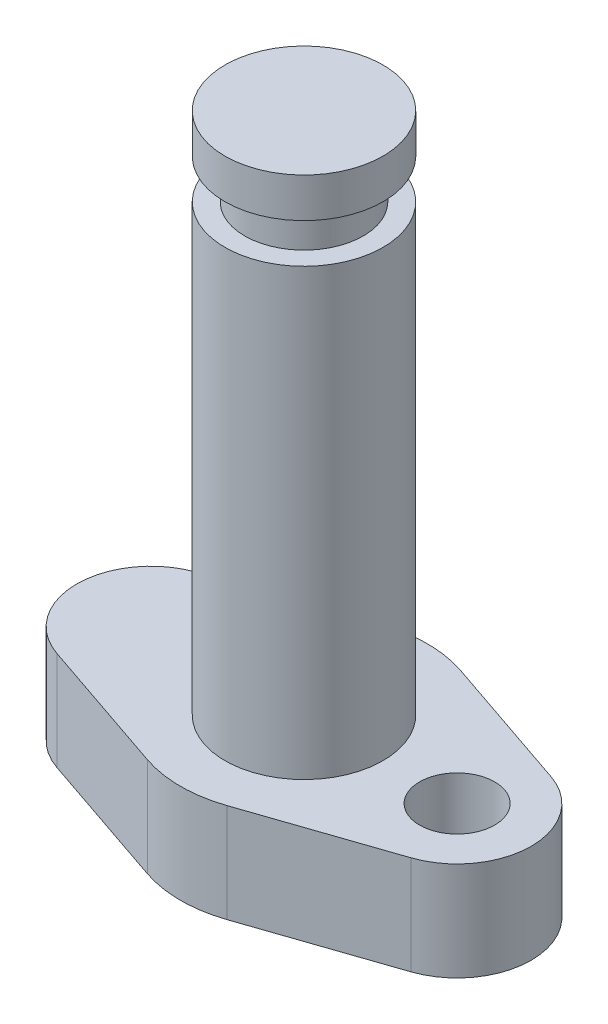
ISO-10303-21;
HEADER;
FILE_DESCRIPTION(('STEP AP214'),'2;1');
FILE_NAME('part.step','',(''),(''),'','','');
FILE_SCHEMA(('AUTOMOTIVE_DESIGN { 1 0 10303 214 1 1 1 1 }'));
ENDSEC;
DATA;
#1=APPLICATION_CONTEXT('core data for automotive mechanical design processes');
#2=APPLICATION_PROTOCOL_DEFINITION('international standard','automotive_design',2000,#1);
#3=PRODUCT_CONTEXT('',#1,'mechanical');
#4=PRODUCT('Part','Part','',(#3));
#5=PRODUCT_RELATED_PRODUCT_CATEGORY('part','',(#4));
#6=PRODUCT_DEFINITION_FORMATION('','',#4);
#7=PRODUCT_DEFINITION_CONTEXT('part definition',#1,'design');
#8=PRODUCT_DEFINITION('design','',#6,#7);
#9=PRODUCT_DEFINITION_SHAPE('','',#8);
#10=(LENGTH_UNIT() NAMED_UNIT(*) SI_UNIT(.MILLI.,.METRE.));
#11=(NAMED_UNIT(*) PLANE_ANGLE_UNIT() SI_UNIT($,.RADIAN.));
#12=(NAMED_UNIT(*) SI_UNIT($,.STERADIAN.) SOLID_ANGLE_UNIT());
#13=UNCERTAINTY_MEASURE_WITH_UNIT(LENGTH_MEASURE(1.E-05),#10,'distance_accuracy_value','');
#14=(GEOMETRIC_REPRESENTATION_CONTEXT(3) GLOBAL_UNCERTAINTY_ASSIGNED_CONTEXT((#13)) GLOBAL_UNIT_ASSIGNED_CONTEXT((#10,
#11,#12)) REPRESENTATION_CONTEXT('',''));
#15=CARTESIAN_POINT('',(0.,0.,0.));
#16=DIRECTION('',(0.,0.,1.));
#17=DIRECTION('',(1.,0.,0.));
#18=AXIS2_PLACEMENT_3D('',#15,#16,#17);
#19=CARTESIAN_POINT('',(-2.01612903225807,5.,-5.91588739964565));
#20=DIRECTION('',(-0.32258064516129,0.,-0.946541983943304));
#21=DIRECTION('',(-0.946541983943304,0.,0.32258064516129));
#22=AXIS2_PLACEMENT_3D('',#19,#20,#21);
#23=PLANE('',#22);
#24=DIRECTION('',(0.946541983943304,0.,-0.32258064516129));
#25=VECTOR('',#24,1.);
#26=CARTESIAN_POINT('',(-2.01612903225807,0.,-5.91588739964565));
#27=LINE('',#26,#25);
#28=CARTESIAN_POINT('',(-8.95967741935484,0.,-3.54953243978739));
#29=VERTEX_POINT('',#28);
#30=CARTESIAN_POINT('',(-2.01612903225806,0.,-5.91588739964565));
#31=VERTEX_POINT('',#30);
#32=EDGE_CURVE('E132',#29,#31,#27,.T.);
#33=ORIENTED_EDGE('',*,*,#32,.F.);
#34=DIRECTION('',(0.,-1.,0.));
#35=VECTOR('',#34,1.);
#36=CARTESIAN_POINT('',(-8.95967741935484,5.,-3.54953243978739));
#37=LINE('',#36,#35);
#38=CARTESIAN_POINT('',(-8.95967741935484,5.,-3.54953243978739));
#39=VERTEX_POINT('',#38);
#40=EDGE_CURVE('E38',#39,#29,#37,.T.);
#41=ORIENTED_EDGE('',*,*,#40,.F.);
#42=DIRECTION('',(0.946541983943304,0.,-0.32258064516129));
#43=VECTOR('',#42,1.);
#44=CARTESIAN_POINT('',(-2.01612903225807,5.,-5.91588739964565));
#45=LINE('',#44,#43);
#46=CARTESIAN_POINT('',(-2.01612903225806,5.,-5.91588739964565));
#47=VERTEX_POINT('',#46);
#48=EDGE_CURVE('E171',#39,#47,#45,.T.);
#49=ORIENTED_EDGE('',*,*,#48,.T.);
#50=DIRECTION('',(0.,-1.,0.));
#51=VECTOR('',#50,1.);
#52=CARTESIAN_POINT('',(-2.01612903225806,5.,-5.91588739964565));
#53=LINE('',#52,#51);
#54=EDGE_CURVE('E88',#47,#31,#53,.T.);
#55=ORIENTED_EDGE('',*,*,#54,.T.);
#56=EDGE_LOOP('',(#33,#41,#49,#55));
#57=FACE_BOUND('',#56,.T.);
#58=ADVANCED_FACE('F35',(#57),#23,.T.);
#59=CARTESIAN_POINT('',(-7.75,5.,0.));
#60=DIRECTION('',(0.,-1.,0.));
#61=DIRECTION('',(0.,0.,-1.));
#62=AXIS2_PLACEMENT_3D('',#59,#60,#61);
#63=CYLINDRICAL_SURFACE('',#62,3.75);
#64=CARTESIAN_POINT('',(-7.75,0.,0.));
#65=DIRECTION('',(0.,1.,0.));
#66=DIRECTION('',(0.,0.,1.));
#67=AXIS2_PLACEMENT_3D('',#64,#65,#66);
#68=CIRCLE('',#67,3.75);
#69=CARTESIAN_POINT('',(-8.95967741935484,0.,3.54953243978739));
#70=VERTEX_POINT('',#69);
#71=EDGE_CURVE('E135',#29,#70,#68,.T.);
#72=ORIENTED_EDGE('',*,*,#71,.T.);
#73=DIRECTION('',(0.,-1.,0.));
#74=VECTOR('',#73,1.);
#75=CARTESIAN_POINT('',(-8.95967741935484,5.,3.54953243978739));
#76=LINE('',#75,#74);
#77=CARTESIAN_POINT('',(-8.95967741935484,5.,3.54953243978739));
#78=VERTEX_POINT('',#77);
#79=EDGE_CURVE('E157',#78,#70,#76,.T.);
#80=ORIENTED_EDGE('',*,*,#79,.F.);
#81=CARTESIAN_POINT('',(-7.75,5.,0.));
#82=DIRECTION('',(0.,1.,0.));
#83=DIRECTION('',(0.,0.,1.));
#84=AXIS2_PLACEMENT_3D('',#81,#82,#83);
#85=CIRCLE('',#84,3.75);
#86=EDGE_CURVE('E173',#39,#78,#85,.T.);
#87=ORIENTED_EDGE('',*,*,#86,.F.);
#88=ORIENTED_EDGE('',*,*,#40,.T.);
#89=EDGE_LOOP('',(#72,#80,#87,#88));
#90=FACE_BOUND('',#89,.T.);
#91=ADVANCED_FACE('F185',(#90),#63,.T.);
#92=CARTESIAN_POINT('',(-2.01612903225806,5.,5.91588739964565));
#93=DIRECTION('',(0.32258064516129,0.,-0.946541983943304));
#94=DIRECTION('',(-0.946541983943304,0.,-0.32258064516129));
#95=AXIS2_PLACEMENT_3D('',#92,#93,#94);
#96=PLANE('',#95);
#97=DIRECTION('',(0.946541983943304,0.,0.32258064516129));
#98=VECTOR('',#97,1.);
#99=CARTESIAN_POINT('',(-2.01612903225806,0.,5.91588739964565));
#100=LINE('',#99,#98);
#101=CARTESIAN_POINT('',(-2.01612903225806,0.,5.91588739964565));
#102=VERTEX_POINT('',#101);
#103=EDGE_CURVE('E138',#70,#102,#100,.T.);
#104=ORIENTED_EDGE('',*,*,#103,.T.);
#105=DIRECTION('',(0.,-1.,0.));
#106=VECTOR('',#105,1.);
#107=CARTESIAN_POINT('',(-2.01612903225806,5.,5.91588739964565));
#108=LINE('',#107,#106);
#109=CARTESIAN_POINT('',(-2.01612903225806,5.,5.91588739964565));
#110=VERTEX_POINT('',#109);
#111=EDGE_CURVE('E155',#110,#102,#108,.T.);
#112=ORIENTED_EDGE('',*,*,#111,.F.);
#113=DIRECTION('',(0.946541983943304,0.,0.32258064516129));
#114=VECTOR('',#113,1.);
#115=CARTESIAN_POINT('',(-2.01612903225806,5.,5.91588739964565));
#116=LINE('',#115,#114);
#117=EDGE_CURVE('E175',#78,#110,#116,.T.);
#118=ORIENTED_EDGE('',*,*,#117,.F.);
#119=ORIENTED_EDGE('',*,*,#79,.T.);
#120=EDGE_LOOP('',(#104,#112,#118,#119));
#121=FACE_BOUND('',#120,.T.);
#122=ADVANCED_FACE('F186',(#121),#96,.F.);
#123=CARTESIAN_POINT('',(0.,5.,0.));
#124=DIRECTION('',(0.,-1.,0.));
#125=DIRECTION('',(0.,0.,-1.));
#126=AXIS2_PLACEMENT_3D('',#123,#124,#125);
#127=CYLINDRICAL_SURFACE('',#126,6.25);
#128=CARTESIAN_POINT('',(0.,0.,0.));
#129=DIRECTION('',(0.,1.,0.));
#130=DIRECTION('',(0.,0.,1.));
#131=AXIS2_PLACEMENT_3D('',#128,#129,#130);
#132=CIRCLE('',#131,6.25);
#133=CARTESIAN_POINT('',(2.01612903225806,0.,5.91588739964565));
#134=VERTEX_POINT('',#133);
#135=EDGE_CURVE('E140',#102,#134,#132,.T.);
#136=ORIENTED_EDGE('',*,*,#135,.T.);
#137=DIRECTION('',(0.,-1.,0.));
#138=VECTOR('',#137,1.);
#139=CARTESIAN_POINT('',(2.01612903225806,5.,5.91588739964565));
#140=LINE('',#139,#138);
#141=CARTESIAN_POINT('',(2.01612903225806,5.,5.91588739964565));
#142=VERTEX_POINT('',#141);
#143=EDGE_CURVE('E153',#142,#134,#140,.T.);
#144=ORIENTED_EDGE('',*,*,#143,.F.);
#145=CARTESIAN_POINT('',(0.,5.,0.));
#146=DIRECTION('',(0.,1.,0.));
#147=DIRECTION('',(0.,0.,1.));
#148=AXIS2_PLACEMENT_3D('',#145,#146,#147);
#149=CIRCLE('',#148,6.25);
#150=EDGE_CURVE('E129',#110,#142,#149,.T.);
#151=ORIENTED_EDGE('',*,*,#150,.F.);
#152=ORIENTED_EDGE('',*,*,#111,.T.);
#153=EDGE_LOOP('',(#136,#144,#151,#152));
#154=FACE_BOUND('',#153,.T.);
#155=ADVANCED_FACE('F189',(#154),#127,.T.);
#156=CARTESIAN_POINT('',(2.01612903225806,5.,5.91588739964565));
#157=DIRECTION('',(0.32258064516129,0.,0.946541983943304));
#158=DIRECTION('',(0.946541983943304,0.,-0.32258064516129));
#159=AXIS2_PLACEMENT_3D('',#156,#157,#158);
#160=PLANE('',#159);
#161=DIRECTION('',(-0.946541983943304,0.,0.32258064516129));
#162=VECTOR('',#161,1.);
#163=CARTESIAN_POINT('',(2.01612903225806,0.,5.91588739964565));
#164=LINE('',#163,#162);
#165=CARTESIAN_POINT('',(8.95967741935484,0.,3.54953243978739));
#166=VERTEX_POINT('',#165);
#167=EDGE_CURVE('E143',#166,#134,#164,.T.);
#168=ORIENTED_EDGE('',*,*,#167,.F.);
#169=DIRECTION('',(0.,-1.,0.));
#170=VECTOR('',#169,1.);
#171=CARTESIAN_POINT('',(8.95967741935484,5.,3.54953243978739));
#172=LINE('',#171,#170);
#173=CARTESIAN_POINT('',(8.95967741935484,5.,3.54953243978739));
#174=VERTEX_POINT('',#173);
#175=EDGE_CURVE('E124',#174,#166,#172,.T.);
#176=ORIENTED_EDGE('',*,*,#175,.F.);
#177=DIRECTION('',(-0.946541983943304,0.,0.32258064516129));
#178=VECTOR('',#177,1.);
#179=CARTESIAN_POINT('',(2.01612903225806,5.,5.91588739964565));
#180=LINE('',#179,#178);
#181=EDGE_CURVE('E113',#174,#142,#180,.T.);
#182=ORIENTED_EDGE('',*,*,#181,.T.);
#183=ORIENTED_EDGE('',*,*,#143,.T.);
#184=EDGE_LOOP('',(#168,#176,#182,#183));
#185=FACE_BOUND('',#184,.T.);
#186=ADVANCED_FACE('F178',(#185),#160,.T.);
#187=CARTESIAN_POINT('',(7.75,5.,0.));
#188=DIRECTION('',(0.,-1.,0.));
#189=DIRECTION('',(0.,0.,-1.));
#190=AXIS2_PLACEMENT_3D('',#187,#188,#189);
#191=CYLINDRICAL_SURFACE('',#190,3.75);
#192=CARTESIAN_POINT('',(7.75,0.,0.));
#193=DIRECTION('',(0.,1.,0.));
#194=DIRECTION('',(0.,0.,1.));
#195=AXIS2_PLACEMENT_3D('',#192,#193,#194);
#196=CIRCLE('',#195,3.75);
#197=CARTESIAN_POINT('',(8.95967741935484,0.,-3.54953243978739));
#198=VERTEX_POINT('',#197);
#199=EDGE_CURVE('E120',#166,#198,#196,.T.);
#200=ORIENTED_EDGE('',*,*,#199,.T.);
#201=DIRECTION('',(0.,-1.,0.));
#202=VECTOR('',#201,1.);
#203=CARTESIAN_POINT('',(8.95967741935484,5.,-3.54953243978739));
#204=LINE('',#203,#202);
#205=CARTESIAN_POINT('',(8.95967741935484,5.,-3.54953243978739));
#206=VERTEX_POINT('',#205);
#207=EDGE_CURVE('E117',#206,#198,#204,.T.);
#208=ORIENTED_EDGE('',*,*,#207,.F.);
#209=CARTESIAN_POINT('',(7.75,5.,0.));
#210=DIRECTION('',(0.,1.,0.));
#211=DIRECTION('',(0.,0.,1.));
#212=AXIS2_PLACEMENT_3D('',#209,#210,#211);
#213=CIRCLE('',#212,3.75);
#214=EDGE_CURVE('E107',#174,#206,#213,.T.);
#215=ORIENTED_EDGE('',*,*,#214,.F.);
#216=ORIENTED_EDGE('',*,*,#175,.T.);
#217=EDGE_LOOP('',(#200,#208,#215,#216));
#218=FACE_BOUND('',#217,.T.);
#219=ADVANCED_FACE('F118',(#218),#191,.T.);
#220=CARTESIAN_POINT('',(2.01612903225807,5.,-5.91588739964565));
#221=DIRECTION('',(0.32258064516129,0.,-0.946541983943304));
#222=DIRECTION('',(-0.946541983943304,0.,-0.32258064516129));
#223=AXIS2_PLACEMENT_3D('',#220,#221,#222);
#224=PLANE('',#223);
#225=DIRECTION('',(0.946541983943304,0.,0.32258064516129));
#226=VECTOR('',#225,1.);
#227=CARTESIAN_POINT('',(2.01612903225807,0.,-5.91588739964565));
#228=LINE('',#227,#226);
#229=CARTESIAN_POINT('',(2.01612903225806,0.,-5.91588739964565));
#230=VERTEX_POINT('',#229);
#231=EDGE_CURVE('E148',#230,#198,#228,.T.);
#232=ORIENTED_EDGE('',*,*,#231,.F.);
#233=DIRECTION('',(0.,-1.,0.));
#234=VECTOR('',#233,1.);
#235=CARTESIAN_POINT('',(2.01612903225806,5.,-5.91588739964565));
#236=LINE('',#235,#234);
#237=CARTESIAN_POINT('',(2.01612903225806,5.,-5.91588739964565));
#238=VERTEX_POINT('',#237);
#239=EDGE_CURVE('E81',#238,#230,#236,.T.);
#240=ORIENTED_EDGE('',*,*,#239,.F.);
#241=DIRECTION('',(0.946541983943304,0.,0.32258064516129));
#242=VECTOR('',#241,1.);
#243=CARTESIAN_POINT('',(2.01612903225807,5.,-5.91588739964565));
#244=LINE('',#243,#242);
#245=EDGE_CURVE('E111',#238,#206,#244,.T.);
#246=ORIENTED_EDGE('',*,*,#245,.T.);
#247=ORIENTED_EDGE('',*,*,#207,.T.);
#248=EDGE_LOOP('',(#232,#240,#246,#247));
#249=FACE_BOUND('',#248,.T.);
#250=ADVANCED_FACE('F126',(#249),#224,.T.);
#251=EDGE_CURVE('E144',#230,#31,#132,.T.);
#252=ORIENTED_EDGE('',*,*,#251,.T.);
#253=ORIENTED_EDGE('',*,*,#54,.F.);
#254=EDGE_CURVE('E53',#238,#47,#149,.T.);
#255=ORIENTED_EDGE('',*,*,#254,.F.);
#256=ORIENTED_EDGE('',*,*,#239,.T.);
#257=EDGE_LOOP('',(#252,#253,#255,#256));
#258=FACE_BOUND('',#257,.T.);
#259=ADVANCED_FACE('F183',(#258),#127,.T.);
#260=CARTESIAN_POINT('',(0.,5.,0.));
#261=DIRECTION('',(0.,1.,0.));
#262=DIRECTION('',(0.,0.,1.));
#263=AXIS2_PLACEMENT_3D('',#260,#261,#262);
#264=PLANE('',#263);
#265=CARTESIAN_POINT('',(7.75,5.,0.));
#266=DIRECTION('',(0.,1.,0.));
#267=DIRECTION('',(0.,0.,1.));
#268=AXIS2_PLACEMENT_3D('',#265,#266,#267);
#269=CIRCLE('',#268,1.89864999999999);
#270=CARTESIAN_POINT('',(7.75,5.,1.89864999999999));
#271=VERTEX_POINT('',#270);
#272=EDGE_CURVE('E413',#271,#271,#269,.T.);
#273=ORIENTED_EDGE('',*,*,#272,.F.);
#274=EDGE_LOOP('',(#273));
#275=FACE_BOUND('',#274,.T.);
#276=CARTESIAN_POINT('',(0.,5.,0.));
#277=DIRECTION('',(0.,1.,0.));
#278=DIRECTION('',(0.,0.,1.));
#279=AXIS2_PLACEMENT_3D('',#276,#277,#278);
#280=CIRCLE('',#279,4.);
#281=CARTESIAN_POINT('',(0.,5.,-4.));
#282=VERTEX_POINT('',#281);
#283=EDGE_CURVE('E44',#282,#282,#280,.T.);
#284=ORIENTED_EDGE('',*,*,#283,.F.);
#285=EDGE_LOOP('',(#284));
#286=FACE_BOUND('',#285,.T.);
#287=ORIENTED_EDGE('',*,*,#48,.F.);
#288=ORIENTED_EDGE('',*,*,#86,.T.);
#289=ORIENTED_EDGE('',*,*,#117,.T.);
#290=ORIENTED_EDGE('',*,*,#150,.T.);
#291=ORIENTED_EDGE('',*,*,#181,.F.);
#292=ORIENTED_EDGE('',*,*,#214,.T.);
#293=ORIENTED_EDGE('',*,*,#245,.F.);
#294=ORIENTED_EDGE('',*,*,#254,.T.);
#295=EDGE_LOOP('',(#287,#288,#289,#290,#291,#292,#293,#294));
#296=FACE_BOUND('',#295,.T.);
#297=ADVANCED_FACE('F109',(#275,#286,#296),#264,.T.);
#298=CARTESIAN_POINT('',(0.,0.,0.));
#299=DIRECTION('',(0.,1.,0.));
#300=DIRECTION('',(0.,0.,1.));
#301=AXIS2_PLACEMENT_3D('',#298,#299,#300);
#302=PLANE('',#301);
#303=CARTESIAN_POINT('',(7.75,0.,0.));
#304=DIRECTION('',(0.,1.,0.));
#305=DIRECTION('',(0.,0.,1.));
#306=AXIS2_PLACEMENT_3D('',#303,#304,#305);
#307=CIRCLE('',#306,1.89865);
#308=CARTESIAN_POINT('',(7.75,0.,1.89865));
#309=VERTEX_POINT('',#308);
#310=EDGE_CURVE('E410',#309,#309,#307,.T.);
#311=ORIENTED_EDGE('',*,*,#310,.T.);
#312=EDGE_LOOP('',(#311));
#313=FACE_BOUND('',#312,.T.);
#314=CARTESIAN_POINT('',(0.,0.,0.));
#315=DIRECTION('',(0.,1.,0.));
#316=DIRECTION('',(0.,0.,1.));
#317=AXIS2_PLACEMENT_3D('',#314,#315,#316);
#318=CIRCLE('',#317,1.89865);
#319=CARTESIAN_POINT('',(0.,0.,1.89865));
#320=VERTEX_POINT('',#319);
#321=EDGE_CURVE('E420',#320,#320,#318,.T.);
#322=ORIENTED_EDGE('',*,*,#321,.T.);
#323=EDGE_LOOP('',(#322));
#324=FACE_BOUND('',#323,.T.);
#325=ORIENTED_EDGE('',*,*,#32,.T.);
#326=ORIENTED_EDGE('',*,*,#251,.F.);
#327=ORIENTED_EDGE('',*,*,#231,.T.);
#328=ORIENTED_EDGE('',*,*,#199,.F.);
#329=ORIENTED_EDGE('',*,*,#167,.T.);
#330=ORIENTED_EDGE('',*,*,#135,.F.);
#331=ORIENTED_EDGE('',*,*,#103,.F.);
#332=ORIENTED_EDGE('',*,*,#71,.F.);
#333=EDGE_LOOP('',(#325,#326,#327,#328,#329,#330,#331,#332));
#334=FACE_BOUND('',#333,.T.);
#335=ADVANCED_FACE('F181',(#313,#324,#334),#302,.F.);
#336=CARTESIAN_POINT('',(0.,27.5,0.));
#337=DIRECTION('',(0.,-1.,0.));
#338=DIRECTION('',(0.,0.,-1.));
#339=AXIS2_PLACEMENT_3D('',#336,#337,#338);
#340=CYLINDRICAL_SURFACE('',#339,4.);
#341=CARTESIAN_POINT('',(0.,27.5,0.));
#342=DIRECTION('',(0.,1.,0.));
#343=DIRECTION('',(0.,0.,1.));
#344=AXIS2_PLACEMENT_3D('',#341,#342,#343);
#345=CIRCLE('',#344,4.);
#346=CARTESIAN_POINT('',(0.,27.5,-4.));
#347=VERTEX_POINT('',#346);
#348=EDGE_CURVE('E136',#347,#347,#345,.T.);
#349=CARTESIAN_POINT('',(0.,27.5,-4.));
#350=CARTESIAN_POINT('',(0.,27.265625,-4.));
#351=CARTESIAN_POINT('',(0.,27.03125,-4.));
#352=CARTESIAN_POINT('',(0.,26.5625,-4.));
#353=CARTESIAN_POINT('',(0.,26.328125,-4.));
#354=CARTESIAN_POINT('',(0.,25.859375,-4.));
#355=CARTESIAN_POINT('',(0.,25.625,-4.));
#356=CARTESIAN_POINT('',(0.,25.15625,-4.));
#357=CARTESIAN_POINT('',(0.,24.921875,-4.));
#358=CARTESIAN_POINT('',(0.,24.453125,-4.));
#359=CARTESIAN_POINT('',(0.,24.21875,-4.));
#360=CARTESIAN_POINT('',(0.,23.75,-4.));
#361=CARTESIAN_POINT('',(0.,23.515625,-4.));
#362=CARTESIAN_POINT('',(0.,23.046875,-4.));
#363=CARTESIAN_POINT('',(0.,22.8125,-4.));
#364=CARTESIAN_POINT('',(0.,22.34375,-4.));
#365=CARTESIAN_POINT('',(0.,22.109375,-4.));
#366=CARTESIAN_POINT('',(0.,21.640625,-4.));
#367=CARTESIAN_POINT('',(0.,21.40625,-4.));
#368=CARTESIAN_POINT('',(0.,20.9375,-4.));
#369=CARTESIAN_POINT('',(0.,20.703125,-4.));
#370=CARTESIAN_POINT('',(0.,20.234375,-4.));
#371=CARTESIAN_POINT('',(0.,20.,-4.));
#372=CARTESIAN_POINT('',(0.,19.53125,-4.));
#373=CARTESIAN_POINT('',(0.,19.296875,-4.));
#374=CARTESIAN_POINT('',(0.,18.828125,-4.));
#375=CARTESIAN_POINT('',(0.,18.59375,-4.));
#376=CARTESIAN_POINT('',(0.,18.125,-4.));
#377=CARTESIAN_POINT('',(0.,17.890625,-4.));
#378=CARTESIAN_POINT('',(0.,17.421875,-4.));
#379=CARTESIAN_POINT('',(0.,17.1875,-4.));
#380=CARTESIAN_POINT('',(0.,16.71875,-4.));
#381=CARTESIAN_POINT('',(0.,16.484375,-4.));
#382=CARTESIAN_POINT('',(0.,16.015625,-4.));
#383=CARTESIAN_POINT('',(0.,15.78125,-4.));
#384=CARTESIAN_POINT('',(0.,15.3125,-4.));
#385=CARTESIAN_POINT('',(0.,15.078125,-4.));
#386=CARTESIAN_POINT('',(0.,14.609375,-4.));
#387=CARTESIAN_POINT('',(0.,14.375,-4.));
#388=CARTESIAN_POINT('',(0.,13.90625,-4.));
#389=CARTESIAN_POINT('',(0.,13.671875,-4.));
#390=CARTESIAN_POINT('',(0.,13.203125,-4.));
#391=CARTESIAN_POINT('',(0.,12.96875,-4.));
#392=CARTESIAN_POINT('',(0.,12.5,-4.));
#393=CARTESIAN_POINT('',(0.,12.265625,-4.));
#394=CARTESIAN_POINT('',(0.,11.796875,-4.));
#395=CARTESIAN_POINT('',(0.,11.5625,-4.));
#396=CARTESIAN_POINT('',(0.,11.09375,-4.));
#397=CARTESIAN_POINT('',(0.,10.859375,-4.));
#398=CARTESIAN_POINT('',(0.,10.390625,-4.));
#399=CARTESIAN_POINT('',(0.,10.15625,-4.));
#400=CARTESIAN_POINT('',(0.,9.6875,-4.));
#401=CARTESIAN_POINT('',(0.,9.453125,-4.));
#402=CARTESIAN_POINT('',(0.,8.984375,-4.));
#403=CARTESIAN_POINT('',(0.,8.75,-4.));
#404=CARTESIAN_POINT('',(0.,8.28125,-4.));
#405=CARTESIAN_POINT('',(0.,8.046875,-4.));
#406=CARTESIAN_POINT('',(0.,7.578125,-4.));
#407=CARTESIAN_POINT('',(0.,7.34375,-4.));
#408=CARTESIAN_POINT('',(0.,6.875,-4.));
#409=CARTESIAN_POINT('',(0.,6.640625,-4.));
#410=CARTESIAN_POINT('',(0.,6.171875,-4.));
#411=CARTESIAN_POINT('',(0.,5.9375,-4.));
#412=CARTESIAN_POINT('',(0.,5.46875,-4.));
#413=CARTESIAN_POINT('',(0.,5.234375,-4.));
#414=CARTESIAN_POINT('',(0.,5.,-4.));
#415=B_SPLINE_CURVE_WITH_KNOTS('',3,(#349,#350,#351,#352,#353,#354,#355,#356,#357,#358,#359,
#360,#361,#362,#363,#364,#365,#366,#367,#368,#369,#370,#371,#372,#373,#374,#375,#376,#377,#378,
#379,#380,#381,#382,#383,#384,#385,#386,#387,#388,#389,#390,#391,#392,#393,#394,#395,#396,#397,
#398,#399,#400,#401,#402,#403,#404,#405,#406,#407,#408,#409,#410,#411,#412,#413,#414),
.UNSPECIFIED.,.F.,.F.,(4,2,2,2,2,2,2,2,2,2,2,2,2,2,2,2,2,2,2,2,2,2,2,2,2,2,2,2,2,2,2,2,4),(0.,
0.703125000000002,1.40625,2.109375,2.8125,3.515625,4.21875,4.921875,5.625,6.328125,7.03125,
7.734375,8.4375,9.140625,9.84375,10.546875,11.25,11.953125,12.65625,13.359375,14.0625,14.765625,
15.46875,16.171875,16.875,17.578125,18.28125,18.984375,19.6875,20.390625,21.09375,21.796875,
22.5),.UNSPECIFIED.);
#416=EDGE_CURVE('BSEAM233',#347,#282,#415,.T.);
#417=ORIENTED_EDGE('',*,*,#348,.F.);
#418=ORIENTED_EDGE('',*,*,#283,.T.);
#419=ORIENTED_EDGE('',*,*,#416,.T.);
#420=ORIENTED_EDGE('',*,*,#416,.F.);
#421=EDGE_LOOP('',(#417,#419,#418,#420));
#422=FACE_BOUND('',#421,.T.);
#423=ADVANCED_FACE('F233',(#422),#340,.T.);
#424=CARTESIAN_POINT('',(0.,27.5,0.));
#425=DIRECTION('',(0.,1.,0.));
#426=DIRECTION('',(0.,0.,1.));
#427=AXIS2_PLACEMENT_3D('',#424,#425,#426);
#428=PLANE('',#427);
#429=CARTESIAN_POINT('',(0.,27.5,0.));
#430=DIRECTION('',(0.,1.,0.));
#431=DIRECTION('',(0.,0.,1.));
#432=AXIS2_PLACEMENT_3D('',#429,#430,#431);
#433=CIRCLE('',#432,3.);
#434=CARTESIAN_POINT('',(0.,27.5,3.));
#435=VERTEX_POINT('',#434);
#436=EDGE_CURVE('E11',#435,#435,#433,.T.);
#437=ORIENTED_EDGE('',*,*,#436,.F.);
#438=EDGE_LOOP('',(#437));
#439=FACE_BOUND('',#438,.T.);
#440=ORIENTED_EDGE('',*,*,#348,.T.);
#441=EDGE_LOOP('',(#440));
#442=FACE_BOUND('',#441,.T.);
#443=ADVANCED_FACE('F240',(#439,#442),#428,.T.);
#444=CARTESIAN_POINT('',(0.,29.5,0.));
#445=DIRECTION('',(0.,-1.,0.));
#446=DIRECTION('',(0.,0.,-1.));
#447=AXIS2_PLACEMENT_3D('',#444,#445,#446);
#448=CYLINDRICAL_SURFACE('',#447,3.);
#449=CARTESIAN_POINT('',(0.,29.5,0.));
#450=DIRECTION('',(0.,1.,0.));
#451=DIRECTION('',(0.,0.,1.));
#452=AXIS2_PLACEMENT_3D('',#449,#450,#451);
#453=CIRCLE('',#452,3.);
#454=CARTESIAN_POINT('',(0.,29.5,3.));
#455=VERTEX_POINT('',#454);
#456=EDGE_CURVE('E427',#455,#455,#453,.T.);
#457=ORIENTED_EDGE('',*,*,#456,.F.);
#458=EDGE_LOOP('',(#457));
#459=FACE_BOUND('',#458,.T.);
#460=ORIENTED_EDGE('',*,*,#436,.T.);
#461=EDGE_LOOP('',(#460));
#462=FACE_BOUND('',#461,.T.);
#463=ADVANCED_FACE('F248',(#459,#462),#448,.T.);
#464=CARTESIAN_POINT('',(0.,31.5,0.));
#465=DIRECTION('',(0.,-1.,0.));
#466=DIRECTION('',(0.,0.,-1.));
#467=AXIS2_PLACEMENT_3D('',#464,#465,#466);
#468=CYLINDRICAL_SURFACE('',#467,4.);
#469=CARTESIAN_POINT('',(0.,31.5,0.));
#470=DIRECTION('',(0.,1.,0.));
#471=DIRECTION('',(0.,0.,1.));
#472=AXIS2_PLACEMENT_3D('',#469,#470,#471);
#473=CIRCLE('',#472,4.);
#474=CARTESIAN_POINT('',(0.,31.5,4.));
#475=VERTEX_POINT('',#474);
#476=EDGE_CURVE('E424',#475,#475,#473,.T.);
#477=ORIENTED_EDGE('',*,*,#476,.F.);
#478=EDGE_LOOP('',(#477));
#479=FACE_BOUND('',#478,.T.);
#480=CARTESIAN_POINT('',(0.,29.5,0.));
#481=DIRECTION('',(0.,1.,0.));
#482=DIRECTION('',(0.,0.,1.));
#483=AXIS2_PLACEMENT_3D('',#480,#481,#482);
#484=CIRCLE('',#483,4.);
#485=CARTESIAN_POINT('',(0.,29.5,4.));
#486=VERTEX_POINT('',#485);
#487=EDGE_CURVE('E423',#486,#486,#484,.T.);
#488=ORIENTED_EDGE('',*,*,#487,.T.);
#489=EDGE_LOOP('',(#488));
#490=FACE_BOUND('',#489,.T.);
#491=ADVANCED_FACE('F256',(#479,#490),#468,.T.);
#492=CARTESIAN_POINT('',(0.,31.5,0.));
#493=DIRECTION('',(0.,1.,0.));
#494=DIRECTION('',(0.,0.,1.));
#495=AXIS2_PLACEMENT_3D('',#492,#493,#494);
#496=PLANE('',#495);
#497=ORIENTED_EDGE('',*,*,#476,.T.);
#498=EDGE_LOOP('',(#497));
#499=FACE_BOUND('',#498,.T.);
#500=ADVANCED_FACE('F264',(#499),#496,.T.);
#501=CARTESIAN_POINT('',(0.,29.5,0.));
#502=DIRECTION('',(0.,1.,0.));
#503=DIRECTION('',(0.,0.,1.));
#504=AXIS2_PLACEMENT_3D('',#501,#502,#503);
#505=PLANE('',#504);
#506=ORIENTED_EDGE('',*,*,#456,.T.);
#507=EDGE_LOOP('',(#506));
#508=FACE_BOUND('',#507,.T.);
#509=ORIENTED_EDGE('',*,*,#487,.F.);
#510=EDGE_LOOP('',(#509));
#511=FACE_BOUND('',#510,.T.);
#512=ADVANCED_FACE('F272',(#508,#511),#505,.F.);
#513=CARTESIAN_POINT('',(1.89864999999999,5.,0.));
#514=DIRECTION('',(0.,1.,0.));
#515=DIRECTION('',(0.,0.,1.));
#516=AXIS2_PLACEMENT_3D('',#513,#514,#515);
#517=PLANE('',#516);
#518=CARTESIAN_POINT('',(0.,5.,0.));
#519=DIRECTION('',(0.,1.,0.));
#520=DIRECTION('',(0.,0.,1.));
#521=AXIS2_PLACEMENT_3D('',#518,#519,#520);
#522=CIRCLE('',#521,1.89864999999999);
#523=CARTESIAN_POINT('',(0.,5.,1.89864999999999));
#524=VERTEX_POINT('',#523);
#525=EDGE_CURVE('E415',#524,#524,#522,.T.);
#526=ORIENTED_EDGE('',*,*,#525,.F.);
#527=EDGE_LOOP('',(#526));
#528=FACE_BOUND('',#527,.T.);
#529=ADVANCED_FACE('F279',(#528),#517,.F.);
#530=CARTESIAN_POINT('',(0.,5.,0.));
#531=DIRECTION('',(0.,1.,0.));
#532=DIRECTION('',(0.,0.,1.));
#533=AXIS2_PLACEMENT_3D('',#530,#531,#532);
#534=CYLINDRICAL_SURFACE('',#533,1.89864999999999);
#535=ORIENTED_EDGE('',*,*,#321,.F.);
#536=EDGE_LOOP('',(#535));
#537=FACE_BOUND('',#536,.T.);
#538=ORIENTED_EDGE('',*,*,#525,.T.);
#539=EDGE_LOOP('',(#538));
#540=FACE_BOUND('',#539,.T.);
#541=ADVANCED_FACE('F286',(#537,#540),#534,.F.);
#542=CARTESIAN_POINT('',(7.75,5.,0.));
#543=DIRECTION('',(0.,1.,0.));
#544=DIRECTION('',(0.,0.,1.));
#545=AXIS2_PLACEMENT_3D('',#542,#543,#544);
#546=CYLINDRICAL_SURFACE('',#545,1.89864999999999);
#547=ORIENTED_EDGE('',*,*,#310,.F.);
#548=EDGE_LOOP('',(#547));
#549=FACE_BOUND('',#548,.T.);
#550=ORIENTED_EDGE('',*,*,#272,.T.);
#551=EDGE_LOOP('',(#550));
#552=FACE_BOUND('',#551,.T.);
#553=ADVANCED_FACE('F294',(#549,#552),#546,.F.);
#554=CLOSED_SHELL('',(#58,#91,#122,#155,#186,#219,#250,#259,#297,#335,#423,#443,#463,#491,#500,
#512,#529,#541,#553));
#555=MANIFOLD_SOLID_BREP('B2',#554);
#556=ADVANCED_BREP_SHAPE_REPRESENTATION('',(#18,#555),#14);
#557=SHAPE_DEFINITION_REPRESENTATION(#9,#556);
ENDSEC;
END-ISO-10303-21;
